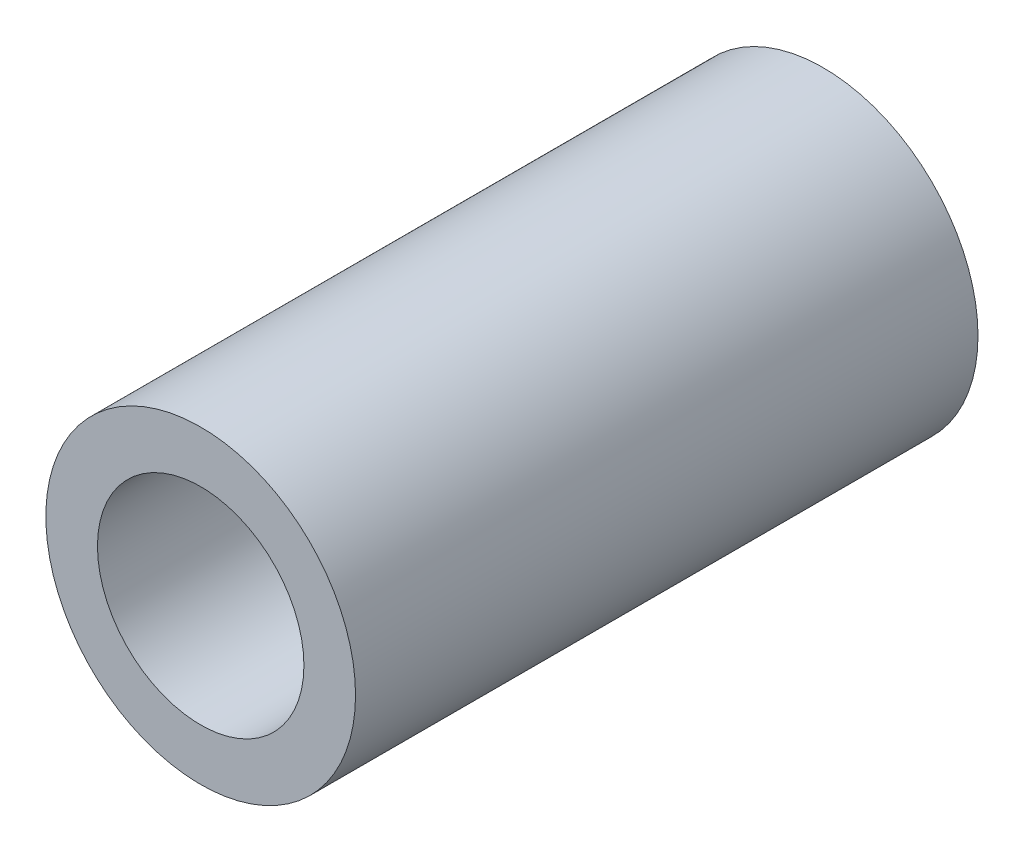
ISO-10303-21;
HEADER;
FILE_DESCRIPTION(('STEP AP214'),'2;1');
FILE_NAME('part.step','',(''),(''),'','','');
FILE_SCHEMA(('AUTOMOTIVE_DESIGN { 1 0 10303 214 1 1 1 1 }'));
ENDSEC;
DATA;
#1=APPLICATION_CONTEXT('core data for automotive mechanical design processes');
#2=APPLICATION_PROTOCOL_DEFINITION('international standard','automotive_design',2000,#1);
#3=PRODUCT_CONTEXT('',#1,'mechanical');
#4=PRODUCT('Part','Part','',(#3));
#5=PRODUCT_RELATED_PRODUCT_CATEGORY('part','',(#4));
#6=PRODUCT_DEFINITION_FORMATION('','',#4);
#7=PRODUCT_DEFINITION_CONTEXT('part definition',#1,'design');
#8=PRODUCT_DEFINITION('design','',#6,#7);
#9=PRODUCT_DEFINITION_SHAPE('','',#8);
#10=(LENGTH_UNIT() NAMED_UNIT(*) SI_UNIT(.MILLI.,.METRE.));
#11=(NAMED_UNIT(*) PLANE_ANGLE_UNIT() SI_UNIT($,.RADIAN.));
#12=(NAMED_UNIT(*) SI_UNIT($,.STERADIAN.) SOLID_ANGLE_UNIT());
#13=UNCERTAINTY_MEASURE_WITH_UNIT(LENGTH_MEASURE(1.E-05),#10,'distance_accuracy_value','');
#14=(GEOMETRIC_REPRESENTATION_CONTEXT(3) GLOBAL_UNCERTAINTY_ASSIGNED_CONTEXT((#13)) GLOBAL_UNIT_ASSIGNED_CONTEXT((#10,
#11,#12)) REPRESENTATION_CONTEXT('',''));
#15=CARTESIAN_POINT('',(0.,0.,0.));
#16=DIRECTION('',(0.,0.,1.));
#17=DIRECTION('',(1.,0.,0.));
#18=AXIS2_PLACEMENT_3D('',#15,#16,#17);
#19=CARTESIAN_POINT('',(0.,38.1,15.3162));
#20=DIRECTION('',(0.,0.,-1.));
#21=DIRECTION('',(-1.,0.,0.));
#22=AXIS2_PLACEMENT_3D('',#19,#20,#21);
#23=CYLINDRICAL_SURFACE('',#22,2.54);
#24=CARTESIAN_POINT('',(0.,38.1,15.3162));
#25=DIRECTION('',(0.,0.,1.));
#26=DIRECTION('',(1.,0.,0.));
#27=AXIS2_PLACEMENT_3D('',#24,#25,#26);
#28=CIRCLE('',#27,2.54);
#29=CARTESIAN_POINT('',(2.54,38.1,15.3162));
#30=VERTEX_POINT('',#29);
#31=EDGE_CURVE('E22',#30,#30,#28,.T.);
#32=ORIENTED_EDGE('',*,*,#31,.T.);
#33=EDGE_LOOP('',(#32));
#34=FACE_BOUND('',#33,.T.);
#35=CARTESIAN_POINT('',(0.,38.1,0.));
#36=DIRECTION('',(0.,0.,1.));
#37=DIRECTION('',(1.,0.,0.));
#38=AXIS2_PLACEMENT_3D('',#35,#36,#37);
#39=CIRCLE('',#38,2.54);
#40=CARTESIAN_POINT('',(2.54,38.1,0.));
#41=VERTEX_POINT('',#40);
#42=EDGE_CURVE('E28',#41,#41,#39,.T.);
#43=ORIENTED_EDGE('',*,*,#42,.F.);
#44=EDGE_LOOP('',(#43));
#45=FACE_BOUND('',#44,.T.);
#46=ADVANCED_FACE('F15',(#34,#45),#23,.F.);
#47=CARTESIAN_POINT('',(0.,38.1,15.3162));
#48=DIRECTION('',(0.,0.,-1.));
#49=DIRECTION('',(-1.,0.,0.));
#50=AXIS2_PLACEMENT_3D('',#47,#48,#49);
#51=CYLINDRICAL_SURFACE('',#50,3.81);
#52=CARTESIAN_POINT('',(0.,38.1,15.3162));
#53=DIRECTION('',(0.,0.,1.));
#54=DIRECTION('',(1.,0.,0.));
#55=AXIS2_PLACEMENT_3D('',#52,#53,#54);
#56=CIRCLE('',#55,3.81);
#57=CARTESIAN_POINT('',(3.81,38.1,15.3162));
#58=VERTEX_POINT('',#57);
#59=EDGE_CURVE('E10',#58,#58,#56,.T.);
#60=ORIENTED_EDGE('',*,*,#59,.F.);
#61=EDGE_LOOP('',(#60));
#62=FACE_BOUND('',#61,.T.);
#63=CARTESIAN_POINT('',(0.,38.1,0.));
#64=DIRECTION('',(0.,0.,1.));
#65=DIRECTION('',(1.,0.,0.));
#66=AXIS2_PLACEMENT_3D('',#63,#64,#65);
#67=CIRCLE('',#66,3.81);
#68=CARTESIAN_POINT('',(3.81,38.1,0.));
#69=VERTEX_POINT('',#68);
#70=EDGE_CURVE('E18',#69,#69,#67,.T.);
#71=ORIENTED_EDGE('',*,*,#70,.T.);
#72=EDGE_LOOP('',(#71));
#73=FACE_BOUND('',#72,.T.);
#74=ADVANCED_FACE('F35',(#62,#73),#51,.T.);
#75=CARTESIAN_POINT('',(0.,47.625,15.3162));
#76=DIRECTION('',(0.,0.,1.));
#77=DIRECTION('',(1.,0.,0.));
#78=AXIS2_PLACEMENT_3D('',#75,#76,#77);
#79=PLANE('',#78);
#80=ORIENTED_EDGE('',*,*,#31,.F.);
#81=EDGE_LOOP('',(#80));
#82=FACE_BOUND('',#81,.T.);
#83=ORIENTED_EDGE('',*,*,#59,.T.);
#84=EDGE_LOOP('',(#83));
#85=FACE_BOUND('',#84,.T.);
#86=ADVANCED_FACE('F39',(#82,#85),#79,.T.);
#87=CARTESIAN_POINT('',(0.,47.625,0.));
#88=DIRECTION('',(0.,0.,1.));
#89=DIRECTION('',(1.,0.,0.));
#90=AXIS2_PLACEMENT_3D('',#87,#88,#89);
#91=PLANE('',#90);
#92=ORIENTED_EDGE('',*,*,#42,.T.);
#93=EDGE_LOOP('',(#92));
#94=FACE_BOUND('',#93,.T.);
#95=ORIENTED_EDGE('',*,*,#70,.F.);
#96=EDGE_LOOP('',(#95));
#97=FACE_BOUND('',#96,.T.);
#98=ADVANCED_FACE('F37',(#94,#97),#91,.F.);
#99=CLOSED_SHELL('',(#46,#74,#86,#98));
#100=MANIFOLD_SOLID_BREP('B1',#99);
#101=ADVANCED_BREP_SHAPE_REPRESENTATION('',(#18,#100),#14);
#102=SHAPE_DEFINITION_REPRESENTATION(#9,#101);
ENDSEC;
END-ISO-10303-21;
